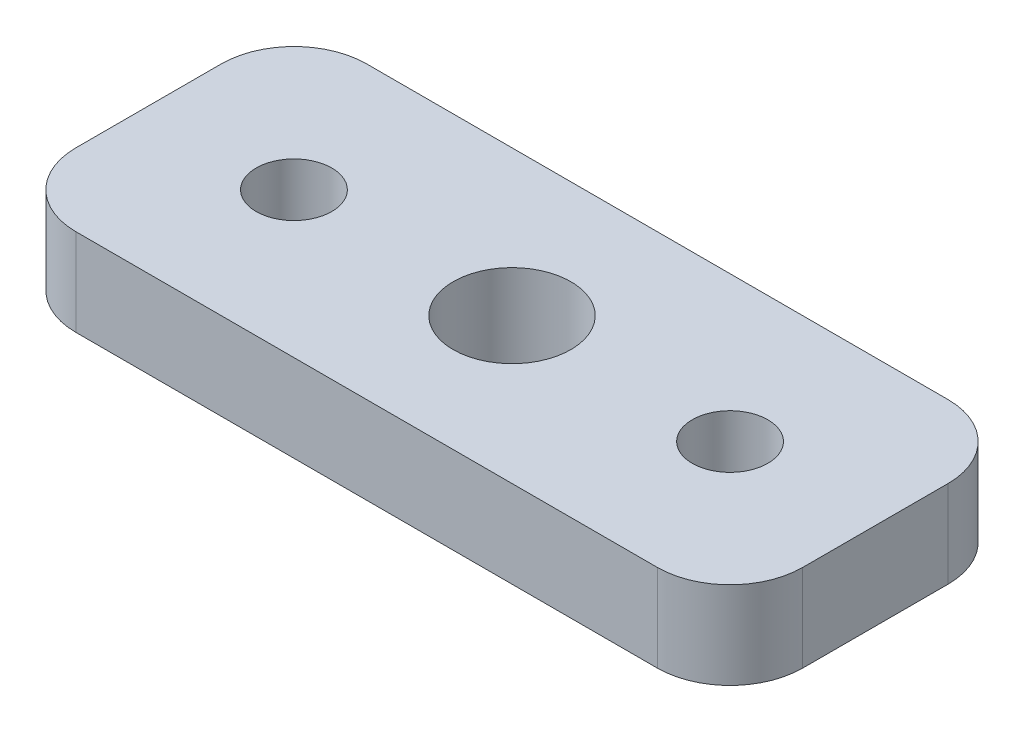
ISO-10303-21;
HEADER;
FILE_DESCRIPTION(('STEP AP214'),'2;1');
FILE_NAME('part.step','',(''),(''),'','','');
FILE_SCHEMA(('AUTOMOTIVE_DESIGN { 1 0 10303 214 1 1 1 1 }'));
ENDSEC;
DATA;
#1=APPLICATION_CONTEXT('core data for automotive mechanical design processes');
#2=APPLICATION_PROTOCOL_DEFINITION('international standard','automotive_design',2000,#1);
#3=PRODUCT_CONTEXT('',#1,'mechanical');
#4=PRODUCT('Part','Part','',(#3));
#5=PRODUCT_RELATED_PRODUCT_CATEGORY('part','',(#4));
#6=PRODUCT_DEFINITION_FORMATION('','',#4);
#7=PRODUCT_DEFINITION_CONTEXT('part definition',#1,'design');
#8=PRODUCT_DEFINITION('design','',#6,#7);
#9=PRODUCT_DEFINITION_SHAPE('','',#8);
#10=(LENGTH_UNIT() NAMED_UNIT(*) SI_UNIT(.MILLI.,.METRE.));
#11=(NAMED_UNIT(*) PLANE_ANGLE_UNIT() SI_UNIT($,.RADIAN.));
#12=(NAMED_UNIT(*) SI_UNIT($,.STERADIAN.) SOLID_ANGLE_UNIT());
#13=UNCERTAINTY_MEASURE_WITH_UNIT(LENGTH_MEASURE(1.E-05),#10,'distance_accuracy_value','');
#14=(GEOMETRIC_REPRESENTATION_CONTEXT(3) GLOBAL_UNCERTAINTY_ASSIGNED_CONTEXT((#13)) GLOBAL_UNIT_ASSIGNED_CONTEXT((#10,
#11,#12)) REPRESENTATION_CONTEXT('',''));
#15=CARTESIAN_POINT('',(0.,0.,0.));
#16=DIRECTION('',(0.,0.,1.));
#17=DIRECTION('',(1.,0.,0.));
#18=AXIS2_PLACEMENT_3D('',#15,#16,#17);
#19=CARTESIAN_POINT('',(25.,3.,-10.));
#20=DIRECTION('',(-1.,0.,0.));
#21=DIRECTION('',(0.,0.,1.));
#22=AXIS2_PLACEMENT_3D('',#19,#20,#21);
#23=PLANE('',#22);
#24=DIRECTION('',(0.,0.,-1.));
#25=VECTOR('',#24,1.);
#26=CARTESIAN_POINT('',(25.,3.,-10.));
#27=LINE('',#26,#25);
#28=CARTESIAN_POINT('',(25.,3.,5.));
#29=VERTEX_POINT('',#28);
#30=CARTESIAN_POINT('',(25.,3.,-5.));
#31=VERTEX_POINT('',#30);
#32=EDGE_CURVE('E117',#29,#31,#27,.T.);
#33=ORIENTED_EDGE('',*,*,#32,.F.);
#34=DIRECTION('',(0.,-1.,0.));
#35=VECTOR('',#34,1.);
#36=CARTESIAN_POINT('',(25.,3.,5.));
#37=LINE('',#36,#35);
#38=CARTESIAN_POINT('',(25.,-3.,5.));
#39=VERTEX_POINT('',#38);
#40=EDGE_CURVE('E102',#29,#39,#37,.T.);
#41=ORIENTED_EDGE('',*,*,#40,.T.);
#42=DIRECTION('',(0.,0.,-1.));
#43=VECTOR('',#42,1.);
#44=CARTESIAN_POINT('',(25.,-3.,-10.));
#45=LINE('',#44,#43);
#46=CARTESIAN_POINT('',(25.,-3.,-5.));
#47=VERTEX_POINT('',#46);
#48=EDGE_CURVE('E114',#39,#47,#45,.T.);
#49=ORIENTED_EDGE('',*,*,#48,.T.);
#50=DIRECTION('',(0.,-1.,0.));
#51=VECTOR('',#50,1.);
#52=CARTESIAN_POINT('',(25.,3.,-5.));
#53=LINE('',#52,#51);
#54=EDGE_CURVE('E119',#47,#31,#53,.F.);
#55=ORIENTED_EDGE('',*,*,#54,.T.);
#56=EDGE_LOOP('',(#33,#41,#49,#55));
#57=FACE_BOUND('',#56,.T.);
#58=ADVANCED_FACE('F32',(#57),#23,.F.);
#59=CARTESIAN_POINT('',(-25.,3.,-10.));
#60=DIRECTION('',(0.,0.,1.));
#61=DIRECTION('',(1.,0.,0.));
#62=AXIS2_PLACEMENT_3D('',#59,#60,#61);
#63=PLANE('',#62);
#64=DIRECTION('',(-1.,0.,0.));
#65=VECTOR('',#64,1.);
#66=CARTESIAN_POINT('',(-25.,-3.,-10.));
#67=LINE('',#66,#65);
#68=CARTESIAN_POINT('',(20.,-3.,-10.));
#69=VERTEX_POINT('',#68);
#70=CARTESIAN_POINT('',(-20.,-3.,-10.));
#71=VERTEX_POINT('',#70);
#72=EDGE_CURVE('E124',#69,#71,#67,.T.);
#73=ORIENTED_EDGE('',*,*,#72,.T.);
#74=DIRECTION('',(0.,-1.,0.));
#75=VECTOR('',#74,1.);
#76=CARTESIAN_POINT('',(-20.,3.,-10.));
#77=LINE('',#76,#75);
#78=CARTESIAN_POINT('',(-20.,3.,-10.));
#79=VERTEX_POINT('',#78);
#80=EDGE_CURVE('E11',#71,#79,#77,.F.);
#81=ORIENTED_EDGE('',*,*,#80,.T.);
#82=DIRECTION('',(-1.,0.,0.));
#83=VECTOR('',#82,1.);
#84=CARTESIAN_POINT('',(-25.,3.,-10.));
#85=LINE('',#84,#83);
#86=CARTESIAN_POINT('',(20.,3.,-10.));
#87=VERTEX_POINT('',#86);
#88=EDGE_CURVE('E163',#87,#79,#85,.T.);
#89=ORIENTED_EDGE('',*,*,#88,.F.);
#90=DIRECTION('',(0.,-1.,0.));
#91=VECTOR('',#90,1.);
#92=CARTESIAN_POINT('',(20.,3.,-10.));
#93=LINE('',#92,#91);
#94=EDGE_CURVE('E40',#87,#69,#93,.T.);
#95=ORIENTED_EDGE('',*,*,#94,.T.);
#96=EDGE_LOOP('',(#73,#81,#89,#95));
#97=FACE_BOUND('',#96,.T.);
#98=ADVANCED_FACE('F161',(#97),#63,.F.);
#99=CARTESIAN_POINT('',(-25.,3.,-10.));
#100=DIRECTION('',(1.,0.,0.));
#101=DIRECTION('',(0.,0.,-1.));
#102=AXIS2_PLACEMENT_3D('',#99,#100,#101);
#103=PLANE('',#102);
#104=DIRECTION('',(0.,0.,1.));
#105=VECTOR('',#104,1.);
#106=CARTESIAN_POINT('',(-25.,3.,-10.));
#107=LINE('',#106,#105);
#108=CARTESIAN_POINT('',(-25.,3.,-5.));
#109=VERTEX_POINT('',#108);
#110=CARTESIAN_POINT('',(-25.,3.,5.));
#111=VERTEX_POINT('',#110);
#112=EDGE_CURVE('E171',#109,#111,#107,.T.);
#113=ORIENTED_EDGE('',*,*,#112,.F.);
#114=DIRECTION('',(0.,-1.,0.));
#115=VECTOR('',#114,1.);
#116=CARTESIAN_POINT('',(-25.,3.,-5.));
#117=LINE('',#116,#115);
#118=CARTESIAN_POINT('',(-25.,-3.,-5.));
#119=VERTEX_POINT('',#118);
#120=EDGE_CURVE('E155',#109,#119,#117,.T.);
#121=ORIENTED_EDGE('',*,*,#120,.T.);
#122=DIRECTION('',(0.,0.,1.));
#123=VECTOR('',#122,1.);
#124=CARTESIAN_POINT('',(-25.,-3.,-10.));
#125=LINE('',#124,#123);
#126=CARTESIAN_POINT('',(-25.,-3.,5.));
#127=VERTEX_POINT('',#126);
#128=EDGE_CURVE('E128',#119,#127,#125,.T.);
#129=ORIENTED_EDGE('',*,*,#128,.T.);
#130=DIRECTION('',(0.,-1.,0.));
#131=VECTOR('',#130,1.);
#132=CARTESIAN_POINT('',(-25.,3.,5.));
#133=LINE('',#132,#131);
#134=EDGE_CURVE('E47',#127,#111,#133,.F.);
#135=ORIENTED_EDGE('',*,*,#134,.T.);
#136=EDGE_LOOP('',(#113,#121,#129,#135));
#137=FACE_BOUND('',#136,.T.);
#138=ADVANCED_FACE('F170',(#137),#103,.F.);
#139=CARTESIAN_POINT('',(-25.,3.,10.));
#140=DIRECTION('',(0.,0.,-1.));
#141=DIRECTION('',(-1.,0.,0.));
#142=AXIS2_PLACEMENT_3D('',#139,#140,#141);
#143=PLANE('',#142);
#144=DIRECTION('',(1.,0.,0.));
#145=VECTOR('',#144,1.);
#146=CARTESIAN_POINT('',(-25.,-3.,10.));
#147=LINE('',#146,#145);
#148=CARTESIAN_POINT('',(-20.,-3.,10.));
#149=VERTEX_POINT('',#148);
#150=CARTESIAN_POINT('',(20.,-3.,10.));
#151=VERTEX_POINT('',#150);
#152=EDGE_CURVE('E138',#149,#151,#147,.T.);
#153=ORIENTED_EDGE('',*,*,#152,.T.);
#154=DIRECTION('',(0.,-1.,0.));
#155=VECTOR('',#154,1.);
#156=CARTESIAN_POINT('',(20.,3.,10.));
#157=LINE('',#156,#155);
#158=CARTESIAN_POINT('',(20.,3.,10.));
#159=VERTEX_POINT('',#158);
#160=EDGE_CURVE('E103',#151,#159,#157,.F.);
#161=ORIENTED_EDGE('',*,*,#160,.T.);
#162=DIRECTION('',(1.,0.,0.));
#163=VECTOR('',#162,1.);
#164=CARTESIAN_POINT('',(-25.,3.,10.));
#165=LINE('',#164,#163);
#166=CARTESIAN_POINT('',(-20.,3.,10.));
#167=VERTEX_POINT('',#166);
#168=EDGE_CURVE('E134',#167,#159,#165,.T.);
#169=ORIENTED_EDGE('',*,*,#168,.F.);
#170=DIRECTION('',(0.,-1.,0.));
#171=VECTOR('',#170,1.);
#172=CARTESIAN_POINT('',(-20.,3.,10.));
#173=LINE('',#172,#171);
#174=EDGE_CURVE('E108',#167,#149,#173,.T.);
#175=ORIENTED_EDGE('',*,*,#174,.T.);
#176=EDGE_LOOP('',(#153,#161,#169,#175));
#177=FACE_BOUND('',#176,.T.);
#178=ADVANCED_FACE('F204',(#177),#143,.F.);
#179=CARTESIAN_POINT('',(0.,3.,0.));
#180=DIRECTION('',(0.,1.,0.));
#181=DIRECTION('',(0.,0.,1.));
#182=AXIS2_PLACEMENT_3D('',#179,#180,#181);
#183=PLANE('',#182);
#184=CARTESIAN_POINT('',(-15.,3.,0.));
#185=DIRECTION('',(0.,1.,0.));
#186=DIRECTION('',(0.,0.,1.));
#187=AXIS2_PLACEMENT_3D('',#184,#185,#186);
#188=CIRCLE('',#187,2.6);
#189=CARTESIAN_POINT('',(-15.,3.,2.6));
#190=VERTEX_POINT('',#189);
#191=EDGE_CURVE('E186',#190,#190,#188,.T.);
#192=ORIENTED_EDGE('',*,*,#191,.F.);
#193=EDGE_LOOP('',(#192));
#194=FACE_BOUND('',#193,.T.);
#195=CARTESIAN_POINT('',(15.,3.,0.));
#196=DIRECTION('',(0.,1.,0.));
#197=DIRECTION('',(0.,0.,-1.));
#198=AXIS2_PLACEMENT_3D('',#195,#196,#197);
#199=CIRCLE('',#198,2.6);
#200=CARTESIAN_POINT('',(15.,3.,-2.6));
#201=VERTEX_POINT('',#200);
#202=EDGE_CURVE('E180',#201,#201,#199,.T.);
#203=ORIENTED_EDGE('',*,*,#202,.F.);
#204=EDGE_LOOP('',(#203));
#205=FACE_BOUND('',#204,.T.);
#206=CARTESIAN_POINT('',(0.,3.,0.));
#207=DIRECTION('',(0.,1.,0.));
#208=DIRECTION('',(0.,0.,1.));
#209=AXIS2_PLACEMENT_3D('',#206,#207,#208);
#210=CIRCLE('',#209,4.05);
#211=CARTESIAN_POINT('',(0.,3.,4.05));
#212=VERTEX_POINT('',#211);
#213=EDGE_CURVE('E131',#212,#212,#210,.T.);
#214=ORIENTED_EDGE('',*,*,#213,.F.);
#215=EDGE_LOOP('',(#214));
#216=FACE_BOUND('',#215,.T.);
#217=ORIENTED_EDGE('',*,*,#168,.T.);
#218=CARTESIAN_POINT('',(20.,3.,5.));
#219=DIRECTION('',(0.,1.,0.));
#220=DIRECTION('',(0.,0.,1.));
#221=AXIS2_PLACEMENT_3D('',#218,#219,#220);
#222=CIRCLE('',#221,5.);
#223=EDGE_CURVE('E152',#159,#29,#222,.T.);
#224=ORIENTED_EDGE('',*,*,#223,.T.);
#225=ORIENTED_EDGE('',*,*,#32,.T.);
#226=CARTESIAN_POINT('',(20.,3.,-5.));
#227=DIRECTION('',(0.,1.,0.));
#228=DIRECTION('',(0.,0.,1.));
#229=AXIS2_PLACEMENT_3D('',#226,#227,#228);
#230=CIRCLE('',#229,5.);
#231=EDGE_CURVE('E149',#31,#87,#230,.T.);
#232=ORIENTED_EDGE('',*,*,#231,.T.);
#233=ORIENTED_EDGE('',*,*,#88,.T.);
#234=CARTESIAN_POINT('',(-20.,3.,-5.));
#235=DIRECTION('',(0.,1.,0.));
#236=DIRECTION('',(0.,0.,1.));
#237=AXIS2_PLACEMENT_3D('',#234,#235,#236);
#238=CIRCLE('',#237,5.);
#239=EDGE_CURVE('E54',#79,#109,#238,.T.);
#240=ORIENTED_EDGE('',*,*,#239,.T.);
#241=ORIENTED_EDGE('',*,*,#112,.T.);
#242=CARTESIAN_POINT('',(-20.,3.,5.));
#243=DIRECTION('',(0.,1.,0.));
#244=DIRECTION('',(0.,0.,1.));
#245=AXIS2_PLACEMENT_3D('',#242,#243,#244);
#246=CIRCLE('',#245,5.);
#247=EDGE_CURVE('E147',#111,#167,#246,.T.);
#248=ORIENTED_EDGE('',*,*,#247,.T.);
#249=EDGE_LOOP('',(#217,#224,#225,#232,#233,#240,#241,#248));
#250=FACE_BOUND('',#249,.T.);
#251=ADVANCED_FACE('F201',(#194,#205,#216,#250),#183,.T.);
#252=CARTESIAN_POINT('',(0.,-3.,0.));
#253=DIRECTION('',(0.,1.,0.));
#254=DIRECTION('',(0.,0.,1.));
#255=AXIS2_PLACEMENT_3D('',#252,#253,#254);
#256=PLANE('',#255);
#257=CARTESIAN_POINT('',(-15.,-3.,0.));
#258=DIRECTION('',(0.,1.,0.));
#259=DIRECTION('',(0.,0.,1.));
#260=AXIS2_PLACEMENT_3D('',#257,#258,#259);
#261=CIRCLE('',#260,2.6);
#262=CARTESIAN_POINT('',(-15.,-3.,2.6));
#263=VERTEX_POINT('',#262);
#264=EDGE_CURVE('E178',#263,#263,#261,.T.);
#265=ORIENTED_EDGE('',*,*,#264,.T.);
#266=EDGE_LOOP('',(#265));
#267=FACE_BOUND('',#266,.T.);
#268=CARTESIAN_POINT('',(15.,-3.,0.));
#269=DIRECTION('',(0.,1.,0.));
#270=DIRECTION('',(0.,0.,-1.));
#271=AXIS2_PLACEMENT_3D('',#268,#269,#270);
#272=CIRCLE('',#271,2.6);
#273=CARTESIAN_POINT('',(15.,-3.,-2.6));
#274=VERTEX_POINT('',#273);
#275=EDGE_CURVE('E183',#274,#274,#272,.T.);
#276=ORIENTED_EDGE('',*,*,#275,.T.);
#277=EDGE_LOOP('',(#276));
#278=FACE_BOUND('',#277,.T.);
#279=CARTESIAN_POINT('',(0.,-3.,0.));
#280=DIRECTION('',(0.,1.,0.));
#281=DIRECTION('',(0.,0.,1.));
#282=AXIS2_PLACEMENT_3D('',#279,#280,#281);
#283=CIRCLE('',#282,4.05);
#284=CARTESIAN_POINT('',(0.,-3.,4.05));
#285=VERTEX_POINT('',#284);
#286=EDGE_CURVE('E125',#285,#285,#283,.T.);
#287=ORIENTED_EDGE('',*,*,#286,.T.);
#288=EDGE_LOOP('',(#287));
#289=FACE_BOUND('',#288,.T.);
#290=ORIENTED_EDGE('',*,*,#48,.F.);
#291=CARTESIAN_POINT('',(20.,-3.,5.));
#292=DIRECTION('',(0.,1.,0.));
#293=DIRECTION('',(0.,0.,1.));
#294=AXIS2_PLACEMENT_3D('',#291,#292,#293);
#295=CIRCLE('',#294,5.);
#296=EDGE_CURVE('E98',#39,#151,#295,.F.);
#297=ORIENTED_EDGE('',*,*,#296,.T.);
#298=ORIENTED_EDGE('',*,*,#152,.F.);
#299=CARTESIAN_POINT('',(-20.,-3.,5.));
#300=DIRECTION('',(0.,1.,0.));
#301=DIRECTION('',(0.,0.,1.));
#302=AXIS2_PLACEMENT_3D('',#299,#300,#301);
#303=CIRCLE('',#302,5.);
#304=EDGE_CURVE('E118',#149,#127,#303,.F.);
#305=ORIENTED_EDGE('',*,*,#304,.T.);
#306=ORIENTED_EDGE('',*,*,#128,.F.);
#307=CARTESIAN_POINT('',(-20.,-3.,-5.));
#308=DIRECTION('',(0.,1.,0.));
#309=DIRECTION('',(0.,0.,1.));
#310=AXIS2_PLACEMENT_3D('',#307,#308,#309);
#311=CIRCLE('',#310,5.);
#312=EDGE_CURVE('E109',#119,#71,#311,.F.);
#313=ORIENTED_EDGE('',*,*,#312,.T.);
#314=ORIENTED_EDGE('',*,*,#72,.F.);
#315=CARTESIAN_POINT('',(20.,-3.,-5.));
#316=DIRECTION('',(0.,1.,0.));
#317=DIRECTION('',(0.,0.,1.));
#318=AXIS2_PLACEMENT_3D('',#315,#316,#317);
#319=CIRCLE('',#318,5.);
#320=EDGE_CURVE('E123',#69,#47,#319,.F.);
#321=ORIENTED_EDGE('',*,*,#320,.T.);
#322=EDGE_LOOP('',(#290,#297,#298,#305,#306,#313,#314,#321));
#323=FACE_BOUND('',#322,.T.);
#324=ADVANCED_FACE('F121',(#267,#278,#289,#323),#256,.F.);
#325=CARTESIAN_POINT('',(0.,-3.,0.));
#326=DIRECTION('',(0.,1.,0.));
#327=DIRECTION('',(0.,0.,1.));
#328=AXIS2_PLACEMENT_3D('',#325,#326,#327);
#329=CYLINDRICAL_SURFACE('',#328,4.05);
#330=ORIENTED_EDGE('',*,*,#286,.F.);
#331=EDGE_LOOP('',(#330));
#332=FACE_BOUND('',#331,.T.);
#333=ORIENTED_EDGE('',*,*,#213,.T.);
#334=EDGE_LOOP('',(#333));
#335=FACE_BOUND('',#334,.T.);
#336=ADVANCED_FACE('F263',(#332,#335),#329,.F.);
#337=CARTESIAN_POINT('',(15.,-3.,0.));
#338=DIRECTION('',(0.,1.,0.));
#339=DIRECTION('',(0.,0.,1.));
#340=AXIS2_PLACEMENT_3D('',#337,#338,#339);
#341=CYLINDRICAL_SURFACE('',#340,2.6);
#342=ORIENTED_EDGE('',*,*,#275,.F.);
#343=EDGE_LOOP('',(#342));
#344=FACE_BOUND('',#343,.T.);
#345=ORIENTED_EDGE('',*,*,#202,.T.);
#346=EDGE_LOOP('',(#345));
#347=FACE_BOUND('',#346,.T.);
#348=ADVANCED_FACE('F197',(#344,#347),#341,.F.);
#349=CARTESIAN_POINT('',(-15.,-3.,0.));
#350=DIRECTION('',(0.,1.,0.));
#351=DIRECTION('',(0.,0.,1.));
#352=AXIS2_PLACEMENT_3D('',#349,#350,#351);
#353=CYLINDRICAL_SURFACE('',#352,2.6);
#354=ORIENTED_EDGE('',*,*,#264,.F.);
#355=EDGE_LOOP('',(#354));
#356=FACE_BOUND('',#355,.T.);
#357=ORIENTED_EDGE('',*,*,#191,.T.);
#358=EDGE_LOOP('',(#357));
#359=FACE_BOUND('',#358,.T.);
#360=ADVANCED_FACE('F194',(#356,#359),#353,.F.);
#361=CARTESIAN_POINT('',(20.,3.,5.));
#362=DIRECTION('',(0.,-1.,0.));
#363=DIRECTION('',(0.,0.,-1.));
#364=AXIS2_PLACEMENT_3D('',#361,#362,#363);
#365=CYLINDRICAL_SURFACE('',#364,5.);
#366=ORIENTED_EDGE('',*,*,#223,.F.);
#367=ORIENTED_EDGE('',*,*,#160,.F.);
#368=ORIENTED_EDGE('',*,*,#296,.F.);
#369=ORIENTED_EDGE('',*,*,#40,.F.);
#370=EDGE_LOOP('',(#366,#367,#368,#369));
#371=FACE_BOUND('',#370,.T.);
#372=ADVANCED_FACE('F101',(#371),#365,.T.);
#373=CARTESIAN_POINT('',(-20.,3.,-5.));
#374=DIRECTION('',(0.,-1.,0.));
#375=DIRECTION('',(0.,0.,-1.));
#376=AXIS2_PLACEMENT_3D('',#373,#374,#375);
#377=CYLINDRICAL_SURFACE('',#376,5.);
#378=ORIENTED_EDGE('',*,*,#239,.F.);
#379=ORIENTED_EDGE('',*,*,#80,.F.);
#380=ORIENTED_EDGE('',*,*,#312,.F.);
#381=ORIENTED_EDGE('',*,*,#120,.F.);
#382=EDGE_LOOP('',(#378,#379,#380,#381));
#383=FACE_BOUND('',#382,.T.);
#384=ADVANCED_FACE('F169',(#383),#377,.T.);
#385=CARTESIAN_POINT('',(20.,3.,-5.));
#386=DIRECTION('',(0.,-1.,0.));
#387=DIRECTION('',(0.,0.,-1.));
#388=AXIS2_PLACEMENT_3D('',#385,#386,#387);
#389=CYLINDRICAL_SURFACE('',#388,5.);
#390=ORIENTED_EDGE('',*,*,#231,.F.);
#391=ORIENTED_EDGE('',*,*,#54,.F.);
#392=ORIENTED_EDGE('',*,*,#320,.F.);
#393=ORIENTED_EDGE('',*,*,#94,.F.);
#394=EDGE_LOOP('',(#390,#391,#392,#393));
#395=FACE_BOUND('',#394,.T.);
#396=ADVANCED_FACE('F214',(#395),#389,.T.);
#397=CARTESIAN_POINT('',(-20.,3.,5.));
#398=DIRECTION('',(0.,-1.,0.));
#399=DIRECTION('',(0.,0.,-1.));
#400=AXIS2_PLACEMENT_3D('',#397,#398,#399);
#401=CYLINDRICAL_SURFACE('',#400,5.);
#402=ORIENTED_EDGE('',*,*,#247,.F.);
#403=ORIENTED_EDGE('',*,*,#134,.F.);
#404=ORIENTED_EDGE('',*,*,#304,.F.);
#405=ORIENTED_EDGE('',*,*,#174,.F.);
#406=EDGE_LOOP('',(#402,#403,#404,#405));
#407=FACE_BOUND('',#406,.T.);
#408=ADVANCED_FACE('F34',(#407),#401,.T.);
#409=CLOSED_SHELL('',(#58,#98,#138,#178,#251,#324,#336,#348,#360,#372,#384,#396,#408));
#410=MANIFOLD_SOLID_BREP('B2',#409);
#411=ADVANCED_BREP_SHAPE_REPRESENTATION('',(#18,#410),#14);
#412=SHAPE_DEFINITION_REPRESENTATION(#9,#411);
ENDSEC;
END-ISO-10303-21;
